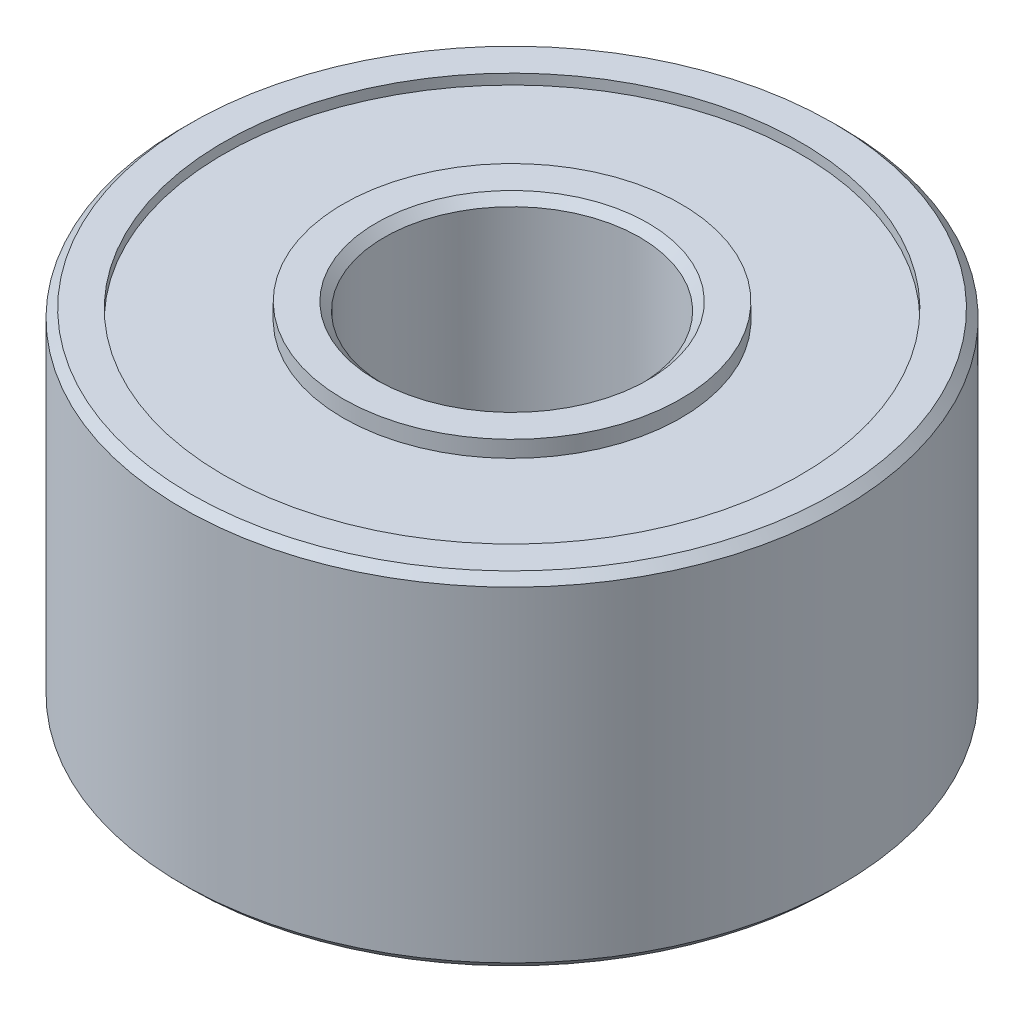
ISO-10303-21;
HEADER;
FILE_DESCRIPTION(('STEP AP214'),'2;1');
FILE_NAME('part.step','',(''),(''),'','','');
FILE_SCHEMA(('AUTOMOTIVE_DESIGN { 1 0 10303 214 1 1 1 1 }'));
ENDSEC;
DATA;
#1=APPLICATION_CONTEXT('core data for automotive mechanical design processes');
#2=APPLICATION_PROTOCOL_DEFINITION('international standard','automotive_design',2000,#1);
#3=PRODUCT_CONTEXT('',#1,'mechanical');
#4=PRODUCT('Part','Part','',(#3));
#5=PRODUCT_RELATED_PRODUCT_CATEGORY('part','',(#4));
#6=PRODUCT_DEFINITION_FORMATION('','',#4);
#7=PRODUCT_DEFINITION_CONTEXT('part definition',#1,'design');
#8=PRODUCT_DEFINITION('design','',#6,#7);
#9=PRODUCT_DEFINITION_SHAPE('','',#8);
#10=(LENGTH_UNIT() NAMED_UNIT(*) SI_UNIT(.MILLI.,.METRE.));
#11=(NAMED_UNIT(*) PLANE_ANGLE_UNIT() SI_UNIT($,.RADIAN.));
#12=(NAMED_UNIT(*) SI_UNIT($,.STERADIAN.) SOLID_ANGLE_UNIT());
#13=UNCERTAINTY_MEASURE_WITH_UNIT(LENGTH_MEASURE(1.E-05),#10,'distance_accuracy_value','');
#14=(GEOMETRIC_REPRESENTATION_CONTEXT(3) GLOBAL_UNCERTAINTY_ASSIGNED_CONTEXT((#13)) GLOBAL_UNIT_ASSIGNED_CONTEXT((#10,
#11,#12)) REPRESENTATION_CONTEXT('',''));
#15=CARTESIAN_POINT('',(0.,0.,0.));
#16=DIRECTION('',(0.,0.,1.));
#17=DIRECTION('',(1.,0.,0.));
#18=AXIS2_PLACEMENT_3D('',#15,#16,#17);
#19=CARTESIAN_POINT('',(0.,-2.,0.));
#20=DIRECTION('',(0.,-1.,0.));
#21=DIRECTION('',(0.,0.,1.));
#22=AXIS2_PLACEMENT_3D('',#19,#20,#21);
#23=CYLINDRICAL_SURFACE('',#22,4.);
#24=CARTESIAN_POINT('',(0.,-1.975,0.));
#25=DIRECTION('',(0.,1.,0.));
#26=DIRECTION('',(0.,0.,1.));
#27=AXIS2_PLACEMENT_3D('',#24,#25,#26);
#28=CIRCLE('',#27,4.);
#29=CARTESIAN_POINT('',(0.,-1.975,-4.));
#30=VERTEX_POINT('',#29);
#31=EDGE_CURVE('E52',#30,#30,#28,.F.);
#32=ORIENTED_EDGE('',*,*,#31,.F.);
#33=EDGE_LOOP('',(#32));
#34=FACE_BOUND('',#33,.T.);
#35=CARTESIAN_POINT('',(0.,1.975,0.));
#36=DIRECTION('',(0.,-1.,0.));
#37=DIRECTION('',(0.,0.,-1.));
#38=AXIS2_PLACEMENT_3D('',#35,#36,#37);
#39=CIRCLE('',#38,4.);
#40=CARTESIAN_POINT('',(0.,1.975,-4.));
#41=VERTEX_POINT('',#40);
#42=EDGE_CURVE('E56',#41,#41,#39,.F.);
#43=ORIENTED_EDGE('',*,*,#42,.F.);
#44=EDGE_LOOP('',(#43));
#45=FACE_BOUND('',#44,.T.);
#46=ADVANCED_FACE('F41',(#34,#45),#23,.T.);
#47=CARTESIAN_POINT('',(4.,2.075,0.));
#48=DIRECTION('',(0.,1.,0.));
#49=DIRECTION('',(0.,0.,-1.));
#50=AXIS2_PLACEMENT_3D('',#47,#48,#49);
#51=PLANE('',#50);
#52=CARTESIAN_POINT('',(0.,2.075,0.));
#53=DIRECTION('',(0.,-1.,0.));
#54=DIRECTION('',(0.,0.,-1.));
#55=AXIS2_PLACEMENT_3D('',#52,#53,#54);
#56=CIRCLE('',#55,3.9);
#57=CARTESIAN_POINT('',(0.,2.075,-3.9));
#58=VERTEX_POINT('',#57);
#59=EDGE_CURVE('E10',#58,#58,#56,.T.);
#60=ORIENTED_EDGE('',*,*,#59,.F.);
#61=EDGE_LOOP('',(#60));
#62=FACE_BOUND('',#61,.T.);
#63=CARTESIAN_POINT('',(0.,2.075,0.));
#64=DIRECTION('',(0.,1.,0.));
#65=DIRECTION('',(0.,0.,1.));
#66=AXIS2_PLACEMENT_3D('',#63,#64,#65);
#67=CIRCLE('',#66,3.5);
#68=CARTESIAN_POINT('',(0.,2.075,3.5));
#69=VERTEX_POINT('',#68);
#70=EDGE_CURVE('E73',#69,#69,#67,.T.);
#71=ORIENTED_EDGE('',*,*,#70,.F.);
#72=EDGE_LOOP('',(#71));
#73=FACE_BOUND('',#72,.T.);
#74=ADVANCED_FACE('F131',(#62,#73),#51,.T.);
#75=CARTESIAN_POINT('',(0.,-2.,0.));
#76=DIRECTION('',(0.,-1.,0.));
#77=DIRECTION('',(0.,0.,1.));
#78=AXIS2_PLACEMENT_3D('',#75,#76,#77);
#79=CYLINDRICAL_SURFACE('',#78,3.5);
#80=CARTESIAN_POINT('',(0.,1.95,0.));
#81=DIRECTION('',(0.,1.,0.));
#82=DIRECTION('',(0.,0.,1.));
#83=AXIS2_PLACEMENT_3D('',#80,#81,#82);
#84=CIRCLE('',#83,3.5);
#85=CARTESIAN_POINT('',(0.,1.95,3.5));
#86=VERTEX_POINT('',#85);
#87=EDGE_CURVE('E76',#86,#86,#84,.T.);
#88=ORIENTED_EDGE('',*,*,#87,.F.);
#89=EDGE_LOOP('',(#88));
#90=FACE_BOUND('',#89,.T.);
#91=ORIENTED_EDGE('',*,*,#70,.T.);
#92=EDGE_LOOP('',(#91));
#93=FACE_BOUND('',#92,.T.);
#94=ADVANCED_FACE('F137',(#90,#93),#79,.F.);
#95=CARTESIAN_POINT('',(3.5,1.95,0.));
#96=DIRECTION('',(0.,1.,0.));
#97=DIRECTION('',(0.,0.,-1.));
#98=AXIS2_PLACEMENT_3D('',#95,#96,#97);
#99=PLANE('',#98);
#100=CARTESIAN_POINT('',(0.,1.95,0.));
#101=DIRECTION('',(0.,1.,0.));
#102=DIRECTION('',(0.,0.,1.));
#103=AXIS2_PLACEMENT_3D('',#100,#101,#102);
#104=CIRCLE('',#103,2.05);
#105=CARTESIAN_POINT('',(0.,1.95,2.05));
#106=VERTEX_POINT('',#105);
#107=EDGE_CURVE('E79',#106,#106,#104,.T.);
#108=ORIENTED_EDGE('',*,*,#107,.F.);
#109=EDGE_LOOP('',(#108));
#110=FACE_BOUND('',#109,.T.);
#111=ORIENTED_EDGE('',*,*,#87,.T.);
#112=EDGE_LOOP('',(#111));
#113=FACE_BOUND('',#112,.T.);
#114=ADVANCED_FACE('F239',(#110,#113),#99,.T.);
#115=CARTESIAN_POINT('',(0.,-2.,0.));
#116=DIRECTION('',(0.,-1.,0.));
#117=DIRECTION('',(0.,0.,1.));
#118=AXIS2_PLACEMENT_3D('',#115,#116,#117);
#119=CYLINDRICAL_SURFACE('',#118,2.05);
#120=CARTESIAN_POINT('',(0.,2.15,0.));
#121=DIRECTION('',(0.,1.,0.));
#122=DIRECTION('',(0.,0.,1.));
#123=AXIS2_PLACEMENT_3D('',#120,#121,#122);
#124=CIRCLE('',#123,2.05);
#125=CARTESIAN_POINT('',(0.,2.15,2.05));
#126=VERTEX_POINT('',#125);
#127=EDGE_CURVE('E82',#126,#126,#124,.T.);
#128=ORIENTED_EDGE('',*,*,#127,.F.);
#129=EDGE_LOOP('',(#128));
#130=FACE_BOUND('',#129,.T.);
#131=ORIENTED_EDGE('',*,*,#107,.T.);
#132=EDGE_LOOP('',(#131));
#133=FACE_BOUND('',#132,.T.);
#134=ADVANCED_FACE('F229',(#130,#133),#119,.T.);
#135=CARTESIAN_POINT('',(2.05,2.15,0.));
#136=DIRECTION('',(0.,1.,0.));
#137=DIRECTION('',(0.,0.,-1.));
#138=AXIS2_PLACEMENT_3D('',#135,#136,#137);
#139=PLANE('',#138);
#140=CARTESIAN_POINT('',(0.,2.15,0.));
#141=DIRECTION('',(0.,-1.,0.));
#142=DIRECTION('',(0.,0.,-1.));
#143=AXIS2_PLACEMENT_3D('',#140,#141,#142);
#144=CIRCLE('',#143,1.65);
#145=CARTESIAN_POINT('',(0.,2.15,-1.65));
#146=VERTEX_POINT('',#145);
#147=EDGE_CURVE('E48',#146,#146,#144,.F.);
#148=ORIENTED_EDGE('',*,*,#147,.F.);
#149=EDGE_LOOP('',(#148));
#150=FACE_BOUND('',#149,.T.);
#151=ORIENTED_EDGE('',*,*,#127,.T.);
#152=EDGE_LOOP('',(#151));
#153=FACE_BOUND('',#152,.T.);
#154=ADVANCED_FACE('F126',(#150,#153),#139,.T.);
#155=CARTESIAN_POINT('',(0.,-2.,0.));
#156=DIRECTION('',(0.,-1.,0.));
#157=DIRECTION('',(0.,0.,1.));
#158=AXIS2_PLACEMENT_3D('',#155,#156,#157);
#159=CYLINDRICAL_SURFACE('',#158,1.55);
#160=CARTESIAN_POINT('',(0.,-2.05,0.));
#161=DIRECTION('',(0.,1.,0.));
#162=DIRECTION('',(0.,0.,1.));
#163=AXIS2_PLACEMENT_3D('',#160,#161,#162);
#164=CIRCLE('',#163,1.55);
#165=CARTESIAN_POINT('',(0.,-2.05,1.55));
#166=VERTEX_POINT('',#165);
#167=EDGE_CURVE('E67',#166,#166,#164,.T.);
#168=ORIENTED_EDGE('',*,*,#167,.F.);
#169=EDGE_LOOP('',(#168));
#170=FACE_BOUND('',#169,.T.);
#171=CARTESIAN_POINT('',(0.,2.05,0.));
#172=DIRECTION('',(0.,-1.,0.));
#173=DIRECTION('',(0.,0.,-1.));
#174=AXIS2_PLACEMENT_3D('',#171,#172,#173);
#175=CIRCLE('',#174,1.55);
#176=CARTESIAN_POINT('',(0.,2.05,-1.55));
#177=VERTEX_POINT('',#176);
#178=EDGE_CURVE('E70',#177,#177,#175,.T.);
#179=ORIENTED_EDGE('',*,*,#178,.F.);
#180=EDGE_LOOP('',(#179));
#181=FACE_BOUND('',#180,.T.);
#182=ADVANCED_FACE('F120',(#170,#181),#159,.F.);
#183=CARTESIAN_POINT('',(1.55,-2.15,0.));
#184=DIRECTION('',(0.,-1.,0.));
#185=DIRECTION('',(0.,0.,1.));
#186=AXIS2_PLACEMENT_3D('',#183,#184,#185);
#187=PLANE('',#186);
#188=CARTESIAN_POINT('',(0.,-2.15,0.));
#189=DIRECTION('',(0.,1.,0.));
#190=DIRECTION('',(0.,0.,1.));
#191=AXIS2_PLACEMENT_3D('',#188,#189,#190);
#192=CIRCLE('',#191,1.65000000000001);
#193=CARTESIAN_POINT('',(0.,-2.15,1.65000000000001));
#194=VERTEX_POINT('',#193);
#195=EDGE_CURVE('E64',#194,#194,#192,.F.);
#196=ORIENTED_EDGE('',*,*,#195,.F.);
#197=EDGE_LOOP('',(#196));
#198=FACE_BOUND('',#197,.T.);
#199=CARTESIAN_POINT('',(0.,-2.15,0.));
#200=DIRECTION('',(0.,1.,0.));
#201=DIRECTION('',(0.,0.,1.));
#202=AXIS2_PLACEMENT_3D('',#199,#200,#201);
#203=CIRCLE('',#202,2.05);
#204=CARTESIAN_POINT('',(0.,-2.15,2.05));
#205=VERTEX_POINT('',#204);
#206=EDGE_CURVE('E85',#205,#205,#203,.T.);
#207=ORIENTED_EDGE('',*,*,#206,.F.);
#208=EDGE_LOOP('',(#207));
#209=FACE_BOUND('',#208,.T.);
#210=ADVANCED_FACE('F115',(#198,#209),#187,.T.);
#211=CARTESIAN_POINT('',(0.,-2.,0.));
#212=DIRECTION('',(0.,-1.,0.));
#213=DIRECTION('',(0.,0.,1.));
#214=AXIS2_PLACEMENT_3D('',#211,#212,#213);
#215=CYLINDRICAL_SURFACE('',#214,2.05);
#216=CARTESIAN_POINT('',(0.,-1.95,0.));
#217=DIRECTION('',(0.,1.,0.));
#218=DIRECTION('',(0.,0.,1.));
#219=AXIS2_PLACEMENT_3D('',#216,#217,#218);
#220=CIRCLE('',#219,2.05);
#221=CARTESIAN_POINT('',(0.,-1.95,2.05));
#222=VERTEX_POINT('',#221);
#223=EDGE_CURVE('E88',#222,#222,#220,.T.);
#224=ORIENTED_EDGE('',*,*,#223,.F.);
#225=EDGE_LOOP('',(#224));
#226=FACE_BOUND('',#225,.T.);
#227=ORIENTED_EDGE('',*,*,#206,.T.);
#228=EDGE_LOOP('',(#227));
#229=FACE_BOUND('',#228,.T.);
#230=ADVANCED_FACE('F109',(#226,#229),#215,.T.);
#231=CARTESIAN_POINT('',(2.05,-1.95,0.));
#232=DIRECTION('',(0.,-1.,0.));
#233=DIRECTION('',(0.,0.,1.));
#234=AXIS2_PLACEMENT_3D('',#231,#232,#233);
#235=PLANE('',#234);
#236=CARTESIAN_POINT('',(0.,-1.95,0.));
#237=DIRECTION('',(0.,1.,0.));
#238=DIRECTION('',(0.,0.,1.));
#239=AXIS2_PLACEMENT_3D('',#236,#237,#238);
#240=CIRCLE('',#239,3.5);
#241=CARTESIAN_POINT('',(0.,-1.95,3.5));
#242=VERTEX_POINT('',#241);
#243=EDGE_CURVE('E91',#242,#242,#240,.T.);
#244=ORIENTED_EDGE('',*,*,#243,.F.);
#245=EDGE_LOOP('',(#244));
#246=FACE_BOUND('',#245,.T.);
#247=ORIENTED_EDGE('',*,*,#223,.T.);
#248=EDGE_LOOP('',(#247));
#249=FACE_BOUND('',#248,.T.);
#250=ADVANCED_FACE('F103',(#246,#249),#235,.T.);
#251=CARTESIAN_POINT('',(0.,-2.,0.));
#252=DIRECTION('',(0.,-1.,0.));
#253=DIRECTION('',(0.,0.,1.));
#254=AXIS2_PLACEMENT_3D('',#251,#252,#253);
#255=CYLINDRICAL_SURFACE('',#254,3.5);
#256=CARTESIAN_POINT('',(0.,-2.075,0.));
#257=DIRECTION('',(0.,1.,0.));
#258=DIRECTION('',(0.,0.,1.));
#259=AXIS2_PLACEMENT_3D('',#256,#257,#258);
#260=CIRCLE('',#259,3.5);
#261=CARTESIAN_POINT('',(0.,-2.075,3.5));
#262=VERTEX_POINT('',#261);
#263=EDGE_CURVE('E94',#262,#262,#260,.T.);
#264=ORIENTED_EDGE('',*,*,#263,.F.);
#265=EDGE_LOOP('',(#264));
#266=FACE_BOUND('',#265,.T.);
#267=ORIENTED_EDGE('',*,*,#243,.T.);
#268=EDGE_LOOP('',(#267));
#269=FACE_BOUND('',#268,.T.);
#270=ADVANCED_FACE('F100',(#266,#269),#255,.F.);
#271=CARTESIAN_POINT('',(3.5,-2.075,0.));
#272=DIRECTION('',(0.,-1.,0.));
#273=DIRECTION('',(0.,0.,1.));
#274=AXIS2_PLACEMENT_3D('',#271,#272,#273);
#275=PLANE('',#274);
#276=CARTESIAN_POINT('',(0.,-2.075,0.));
#277=DIRECTION('',(0.,1.,0.));
#278=DIRECTION('',(0.,0.,1.));
#279=AXIS2_PLACEMENT_3D('',#276,#277,#278);
#280=CIRCLE('',#279,3.9);
#281=CARTESIAN_POINT('',(0.,-2.075,-3.9));
#282=VERTEX_POINT('',#281);
#283=EDGE_CURVE('E61',#282,#282,#280,.T.);
#284=ORIENTED_EDGE('',*,*,#283,.F.);
#285=EDGE_LOOP('',(#284));
#286=FACE_BOUND('',#285,.T.);
#287=ORIENTED_EDGE('',*,*,#263,.T.);
#288=EDGE_LOOP('',(#287));
#289=FACE_BOUND('',#288,.T.);
#290=ADVANCED_FACE('F98',(#286,#289),#275,.T.);
#291=CARTESIAN_POINT('',(0.,-2.05,0.));
#292=DIRECTION('',(0.,-1.,0.));
#293=DIRECTION('',(0.,0.,1.));
#294=AXIS2_PLACEMENT_3D('',#291,#292,#293);
#295=CONICAL_SURFACE('',#294,1.55,0.785398163397459);
#296=ORIENTED_EDGE('',*,*,#195,.T.);
#297=EDGE_LOOP('',(#296));
#298=FACE_BOUND('',#297,.T.);
#299=ORIENTED_EDGE('',*,*,#167,.T.);
#300=EDGE_LOOP('',(#299));
#301=FACE_BOUND('',#300,.T.);
#302=ADVANCED_FACE('F144',(#298,#301),#295,.F.);
#303=CARTESIAN_POINT('',(0.,-2.075,0.));
#304=DIRECTION('',(0.,1.,0.));
#305=DIRECTION('',(0.,0.,-1.));
#306=AXIS2_PLACEMENT_3D('',#303,#304,#305);
#307=CONICAL_SURFACE('',#306,3.9,0.785398163397448);
#308=CARTESIAN_POINT('',(0.,-1.975,-4.));
#309=CARTESIAN_POINT('',(0.,-1.97604166666667,-3.99895833333333));
#310=CARTESIAN_POINT('',(0.,-1.97708333333334,-3.99791666666667));
#311=CARTESIAN_POINT('',(0.,-1.97916666666667,-3.99583333333333));
#312=CARTESIAN_POINT('',(0.,-1.98020833333334,-3.99479166666667));
#313=CARTESIAN_POINT('',(0.,-1.98229166666667,-3.99270833333333));
#314=CARTESIAN_POINT('',(0.,-1.98333333333334,-3.99166666666667));
#315=CARTESIAN_POINT('',(0.,-1.98541666666667,-3.98958333333333));
#316=CARTESIAN_POINT('',(0.,-1.98645833333334,-3.98854166666667));
#317=CARTESIAN_POINT('',(0.,-1.98854166666667,-3.98645833333333));
#318=CARTESIAN_POINT('',(0.,-1.98958333333334,-3.98541666666667));
#319=CARTESIAN_POINT('',(0.,-1.99166666666667,-3.98333333333333));
#320=CARTESIAN_POINT('',(0.,-1.99270833333334,-3.98229166666667));
#321=CARTESIAN_POINT('',(0.,-1.99479166666667,-3.98020833333333));
#322=CARTESIAN_POINT('',(0.,-1.99583333333334,-3.97916666666667));
#323=CARTESIAN_POINT('',(0.,-1.99791666666667,-3.97708333333334));
#324=CARTESIAN_POINT('',(0.,-1.99895833333334,-3.97604166666667));
#325=CARTESIAN_POINT('',(0.,-2.00104166666667,-3.97395833333334));
#326=CARTESIAN_POINT('',(0.,-2.00208333333334,-3.97291666666667));
#327=CARTESIAN_POINT('',(0.,-2.00416666666667,-3.97083333333333));
#328=CARTESIAN_POINT('',(0.,-2.00520833333334,-3.96979166666667));
#329=CARTESIAN_POINT('',(0.,-2.00729166666667,-3.96770833333334));
#330=CARTESIAN_POINT('',(0.,-2.00833333333334,-3.96666666666667));
#331=CARTESIAN_POINT('',(0.,-2.01041666666667,-3.96458333333334));
#332=CARTESIAN_POINT('',(0.,-2.01145833333334,-3.96354166666667));
#333=CARTESIAN_POINT('',(0.,-2.01354166666667,-3.96145833333334));
#334=CARTESIAN_POINT('',(0.,-2.01458333333334,-3.96041666666667));
#335=CARTESIAN_POINT('',(0.,-2.01666666666667,-3.95833333333334));
#336=CARTESIAN_POINT('',(0.,-2.01770833333334,-3.95729166666667));
#337=CARTESIAN_POINT('',(0.,-2.01979166666667,-3.95520833333334));
#338=CARTESIAN_POINT('',(0.,-2.02083333333334,-3.95416666666667));
#339=CARTESIAN_POINT('',(0.,-2.02291666666667,-3.95208333333334));
#340=CARTESIAN_POINT('',(0.,-2.02395833333334,-3.95104166666667));
#341=CARTESIAN_POINT('',(0.,-2.02604166666667,-3.94895833333334));
#342=CARTESIAN_POINT('',(0.,-2.02708333333334,-3.94791666666667));
#343=CARTESIAN_POINT('',(0.,-2.02916666666667,-3.94583333333334));
#344=CARTESIAN_POINT('',(0.,-2.03020833333334,-3.94479166666667));
#345=CARTESIAN_POINT('',(0.,-2.03229166666667,-3.94270833333334));
#346=CARTESIAN_POINT('',(0.,-2.03333333333334,-3.94166666666667));
#347=CARTESIAN_POINT('',(0.,-2.03541666666667,-3.93958333333334));
#348=CARTESIAN_POINT('',(0.,-2.03645833333334,-3.93854166666667));
#349=CARTESIAN_POINT('',(0.,-2.03854166666667,-3.93645833333334));
#350=CARTESIAN_POINT('',(0.,-2.03958333333334,-3.93541666666667));
#351=CARTESIAN_POINT('',(0.,-2.04166666666667,-3.93333333333334));
#352=CARTESIAN_POINT('',(0.,-2.04270833333334,-3.93229166666667));
#353=CARTESIAN_POINT('',(0.,-2.04479166666667,-3.93020833333334));
#354=CARTESIAN_POINT('',(0.,-2.04583333333334,-3.92916666666667));
#355=CARTESIAN_POINT('',(0.,-2.04791666666667,-3.92708333333334));
#356=CARTESIAN_POINT('',(0.,-2.04895833333333,-3.92604166666667));
#357=CARTESIAN_POINT('',(0.,-2.05104166666667,-3.92395833333334));
#358=CARTESIAN_POINT('',(0.,-2.05208333333334,-3.92291666666667));
#359=CARTESIAN_POINT('',(0.,-2.05416666666667,-3.92083333333334));
#360=CARTESIAN_POINT('',(0.,-2.05520833333334,-3.91979166666667));
#361=CARTESIAN_POINT('',(0.,-2.05729166666667,-3.91770833333334));
#362=CARTESIAN_POINT('',(0.,-2.05833333333334,-3.91666666666667));
#363=CARTESIAN_POINT('',(0.,-2.06041666666667,-3.91458333333334));
#364=CARTESIAN_POINT('',(0.,-2.06145833333333,-3.91354166666667));
#365=CARTESIAN_POINT('',(0.,-2.06354166666667,-3.91145833333334));
#366=CARTESIAN_POINT('',(0.,-2.06458333333333,-3.91041666666667));
#367=CARTESIAN_POINT('',(0.,-2.06666666666667,-3.90833333333334));
#368=CARTESIAN_POINT('',(0.,-2.06770833333333,-3.90729166666667));
#369=CARTESIAN_POINT('',(0.,-2.06979166666667,-3.90520833333334));
#370=CARTESIAN_POINT('',(0.,-2.07083333333333,-3.90416666666667));
#371=CARTESIAN_POINT('',(0.,-2.07291666666667,-3.90208333333334));
#372=CARTESIAN_POINT('',(0.,-2.07395833333333,-3.90104166666667));
#373=CARTESIAN_POINT('',(0.,-2.075,-3.9));
#374=B_SPLINE_CURVE_WITH_KNOTS('',3,(#308,#309,#310,#311,#312,#313,#314,#315,#316,#317,#318,
#319,#320,#321,#322,#323,#324,#325,#326,#327,#328,#329,#330,#331,#332,#333,#334,#335,#336,#337,
#338,#339,#340,#341,#342,#343,#344,#345,#346,#347,#348,#349,#350,#351,#352,#353,#354,#355,#356,
#357,#358,#359,#360,#361,#362,#363,#364,#365,#366,#367,#368,#369,#370,#371,#372,#373),
.UNSPECIFIED.,.F.,.F.,(4,2,2,2,2,2,2,2,2,2,2,2,2,2,2,2,2,2,2,2,2,2,2,2,2,2,2,2,2,2,2,2,4),(0.,
0.00441941738241635,0.0088388347648321,0.0132582521472475,0.0176776695296633,0.0220970869120793,
0.0265165042944951,0.0309359216769105,0.0353553390593262,0.0397747564417426,0.044194173824158,
0.0486135912065738,0.0530330085889898,0.0574524259714056,0.061871843353821,0.0662912607362367,
0.0707106781186528,0.0751300955010685,0.0795495128834843,0.0839689302659003,0.0883883476483161,
0.0928077650307315,0.0972271824131472,0.101646599795563,0.106066017177979,0.110485434560395,
0.114904851942811,0.119324269325227,0.123743686707642,0.128163104090058,0.132582521472474,
0.137001938854889,0.141421356237305),.UNSPECIFIED.);
#375=EDGE_CURVE('BSEAM147',#30,#282,#374,.T.);
#376=ORIENTED_EDGE('',*,*,#31,.T.);
#377=ORIENTED_EDGE('',*,*,#283,.T.);
#378=ORIENTED_EDGE('',*,*,#375,.T.);
#379=ORIENTED_EDGE('',*,*,#375,.F.);
#380=EDGE_LOOP('',(#376,#378,#377,#379));
#381=FACE_BOUND('',#380,.T.);
#382=ADVANCED_FACE('F147',(#381),#307,.T.);
#383=CARTESIAN_POINT('',(0.,2.15,0.));
#384=DIRECTION('',(0.,1.,0.));
#385=DIRECTION('',(0.,0.,-1.));
#386=AXIS2_PLACEMENT_3D('',#383,#384,#385);
#387=CONICAL_SURFACE('',#386,1.65,0.785398163397442);
#388=ORIENTED_EDGE('',*,*,#178,.T.);
#389=EDGE_LOOP('',(#388));
#390=FACE_BOUND('',#389,.T.);
#391=ORIENTED_EDGE('',*,*,#147,.T.);
#392=EDGE_LOOP('',(#391));
#393=FACE_BOUND('',#392,.T.);
#394=ADVANCED_FACE('F150',(#390,#393),#387,.F.);
#395=CARTESIAN_POINT('',(0.,1.975,0.));
#396=DIRECTION('',(0.,-1.,0.));
#397=DIRECTION('',(0.,0.,1.));
#398=AXIS2_PLACEMENT_3D('',#395,#396,#397);
#399=CONICAL_SURFACE('',#398,4.,0.785398163397457);
#400=ORIENTED_EDGE('',*,*,#59,.T.);
#401=EDGE_LOOP('',(#400));
#402=FACE_BOUND('',#401,.T.);
#403=ORIENTED_EDGE('',*,*,#42,.T.);
#404=EDGE_LOOP('',(#403));
#405=FACE_BOUND('',#404,.T.);
#406=ADVANCED_FACE('F43',(#402,#405),#399,.T.);
#407=CLOSED_SHELL('',(#46,#74,#94,#114,#134,#154,#182,#210,#230,#250,#270,#290,#302,#382,#394,#406));
#408=MANIFOLD_SOLID_BREP('B2',#407);
#409=ADVANCED_BREP_SHAPE_REPRESENTATION('',(#18,#408),#14);
#410=SHAPE_DEFINITION_REPRESENTATION(#9,#409);
ENDSEC;
END-ISO-10303-21;
